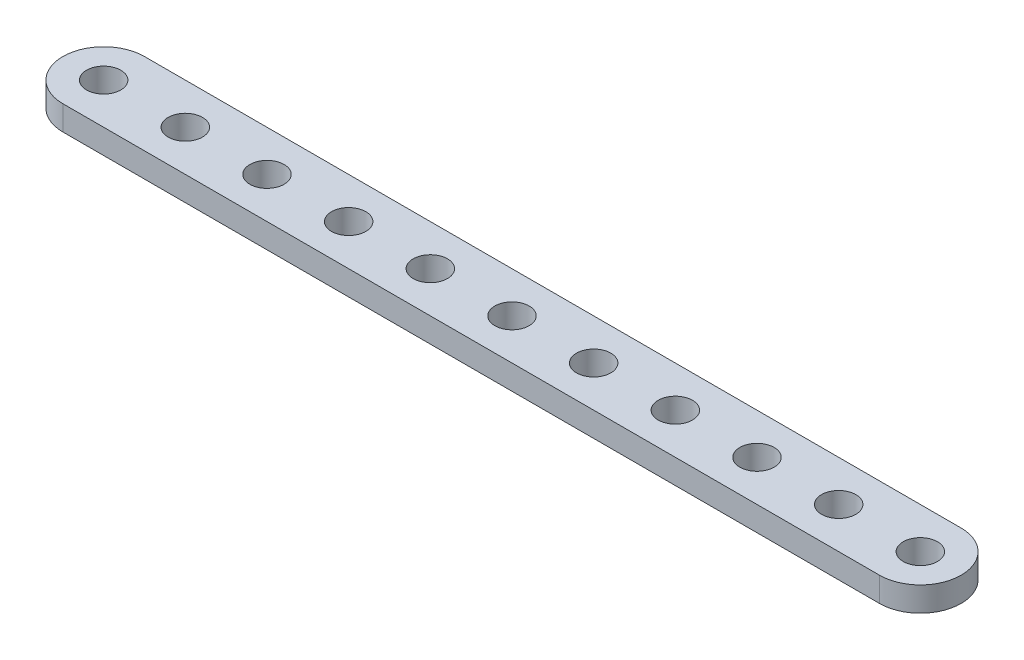
ISO-10303-21;
HEADER;
FILE_DESCRIPTION(('STEP AP214'),'2;1');
FILE_NAME('part.step','',(''),(''),'','','');
FILE_SCHEMA(('AUTOMOTIVE_DESIGN { 1 0 10303 214 1 1 1 1 }'));
ENDSEC;
DATA;
#1=APPLICATION_CONTEXT('core data for automotive mechanical design processes');
#2=APPLICATION_PROTOCOL_DEFINITION('international standard','automotive_design',2000,#1);
#3=PRODUCT_CONTEXT('',#1,'mechanical');
#4=PRODUCT('Part','Part','',(#3));
#5=PRODUCT_RELATED_PRODUCT_CATEGORY('part','',(#4));
#6=PRODUCT_DEFINITION_FORMATION('','',#4);
#7=PRODUCT_DEFINITION_CONTEXT('part definition',#1,'design');
#8=PRODUCT_DEFINITION('design','',#6,#7);
#9=PRODUCT_DEFINITION_SHAPE('','',#8);
#10=(LENGTH_UNIT() NAMED_UNIT(*) SI_UNIT(.MILLI.,.METRE.));
#11=(NAMED_UNIT(*) PLANE_ANGLE_UNIT() SI_UNIT($,.RADIAN.));
#12=(NAMED_UNIT(*) SI_UNIT($,.STERADIAN.) SOLID_ANGLE_UNIT());
#13=UNCERTAINTY_MEASURE_WITH_UNIT(LENGTH_MEASURE(1.E-05),#10,'distance_accuracy_value','');
#14=(GEOMETRIC_REPRESENTATION_CONTEXT(3) GLOBAL_UNCERTAINTY_ASSIGNED_CONTEXT((#13)) GLOBAL_UNIT_ASSIGNED_CONTEXT((#10,
#11,#12)) REPRESENTATION_CONTEXT('',''));
#15=CARTESIAN_POINT('',(0.,0.,0.));
#16=DIRECTION('',(0.,0.,1.));
#17=DIRECTION('',(1.,0.,0.));
#18=AXIS2_PLACEMENT_3D('',#15,#16,#17);
#19=CARTESIAN_POINT('',(-50.,1.5,0.));
#20=DIRECTION('',(0.,1.,0.));
#21=DIRECTION('',(0.,0.,1.));
#22=AXIS2_PLACEMENT_3D('',#19,#20,#21);
#23=PLANE('',#22);
#24=CARTESIAN_POINT('',(-40.,1.5,6.10096939004554E-13));
#25=DIRECTION('',(0.,1.,0.));
#26=DIRECTION('',(0.,0.,1.));
#27=AXIS2_PLACEMENT_3D('',#24,#25,#26);
#28=CIRCLE('',#27,2.1);
#29=CARTESIAN_POINT('',(-40.,1.5,2.10000000000061));
#30=VERTEX_POINT('',#29);
#31=EDGE_CURVE('E202',#30,#30,#28,.T.);
#32=ORIENTED_EDGE('',*,*,#31,.F.);
#33=EDGE_LOOP('',(#32));
#34=FACE_BOUND('',#33,.T.);
#35=CARTESIAN_POINT('',(-20.,1.5,4.70437685450828E-13));
#36=DIRECTION('',(0.,1.,0.));
#37=DIRECTION('',(0.,0.,1.));
#38=AXIS2_PLACEMENT_3D('',#35,#36,#37);
#39=CIRCLE('',#38,2.1);
#40=CARTESIAN_POINT('',(-20.,1.5,2.10000000000047));
#41=VERTEX_POINT('',#40);
#42=EDGE_CURVE('E186',#41,#41,#39,.T.);
#43=ORIENTED_EDGE('',*,*,#42,.F.);
#44=EDGE_LOOP('',(#43));
#45=FACE_BOUND('',#44,.T.);
#46=CARTESIAN_POINT('',(0.,1.5,3.30778431897103E-13));
#47=DIRECTION('',(0.,1.,0.));
#48=DIRECTION('',(0.,0.,1.));
#49=AXIS2_PLACEMENT_3D('',#46,#47,#48);
#50=CIRCLE('',#49,2.1);
#51=CARTESIAN_POINT('',(0.,1.5,2.10000000000033));
#52=VERTEX_POINT('',#51);
#53=EDGE_CURVE('E170',#52,#52,#50,.T.);
#54=ORIENTED_EDGE('',*,*,#53,.F.);
#55=EDGE_LOOP('',(#54));
#56=FACE_BOUND('',#55,.T.);
#57=CARTESIAN_POINT('',(20.,1.5,1.91119178343378E-13));
#58=DIRECTION('',(0.,1.,0.));
#59=DIRECTION('',(0.,0.,1.));
#60=AXIS2_PLACEMENT_3D('',#57,#58,#59);
#61=CIRCLE('',#60,2.1);
#62=CARTESIAN_POINT('',(20.,1.5,2.10000000000019));
#63=VERTEX_POINT('',#62);
#64=EDGE_CURVE('E154',#63,#63,#61,.T.);
#65=ORIENTED_EDGE('',*,*,#64,.F.);
#66=EDGE_LOOP('',(#65));
#67=FACE_BOUND('',#66,.T.);
#68=CARTESIAN_POINT('',(40.,1.5,0.));
#69=DIRECTION('',(0.,1.,0.));
#70=DIRECTION('',(0.,0.,1.));
#71=AXIS2_PLACEMENT_3D('',#68,#69,#70);
#72=CIRCLE('',#71,2.1);
#73=CARTESIAN_POINT('',(40.,1.5,2.10000000000005));
#74=VERTEX_POINT('',#73);
#75=EDGE_CURVE('E138',#74,#74,#72,.T.);
#76=ORIENTED_EDGE('',*,*,#75,.F.);
#77=EDGE_LOOP('',(#76));
#78=FACE_BOUND('',#77,.T.);
#79=CARTESIAN_POINT('',(-50.,1.5,0.));
#80=DIRECTION('',(0.,1.,0.));
#81=DIRECTION('',(0.,0.,1.));
#82=AXIS2_PLACEMENT_3D('',#79,#80,#81);
#83=CIRCLE('',#82,5.);
#84=CARTESIAN_POINT('',(-50.,1.5,-5.));
#85=VERTEX_POINT('',#84);
#86=CARTESIAN_POINT('',(-50.,1.5,5.));
#87=VERTEX_POINT('',#86);
#88=EDGE_CURVE('E96',#85,#87,#83,.T.);
#89=ORIENTED_EDGE('',*,*,#88,.T.);
#90=DIRECTION('',(1.,0.,0.));
#91=VECTOR('',#90,1.);
#92=CARTESIAN_POINT('',(-50.,1.5,5.));
#93=LINE('',#92,#91);
#94=CARTESIAN_POINT('',(50.,1.5,4.99999999999998));
#95=VERTEX_POINT('',#94);
#96=EDGE_CURVE('E91',#87,#95,#93,.T.);
#97=ORIENTED_EDGE('',*,*,#96,.T.);
#98=CARTESIAN_POINT('',(50.,1.5,0.));
#99=DIRECTION('',(0.,1.,0.));
#100=DIRECTION('',(0.,0.,1.));
#101=AXIS2_PLACEMENT_3D('',#98,#99,#100);
#102=CIRCLE('',#101,5.);
#103=CARTESIAN_POINT('',(50.,1.5,-5.00000000000002));
#104=VERTEX_POINT('',#103);
#105=EDGE_CURVE('E94',#95,#104,#102,.T.);
#106=ORIENTED_EDGE('',*,*,#105,.T.);
#107=DIRECTION('',(-1.,0.,0.));
#108=VECTOR('',#107,1.);
#109=CARTESIAN_POINT('',(-50.,1.5,-5.));
#110=LINE('',#109,#108);
#111=EDGE_CURVE('E61',#104,#85,#110,.T.);
#112=ORIENTED_EDGE('',*,*,#111,.T.);
#113=EDGE_LOOP('',(#89,#97,#106,#112));
#114=FACE_BOUND('',#113,.T.);
#115=CARTESIAN_POINT('',(50.,1.5,0.));
#116=DIRECTION('',(0.,1.,0.));
#117=DIRECTION('',(0.,0.,1.));
#118=AXIS2_PLACEMENT_3D('',#115,#116,#117);
#119=CIRCLE('',#118,2.1);
#120=CARTESIAN_POINT('',(50.,1.5,2.09999999999998));
#121=VERTEX_POINT('',#120);
#122=EDGE_CURVE('E116',#121,#121,#119,.T.);
#123=ORIENTED_EDGE('',*,*,#122,.F.);
#124=EDGE_LOOP('',(#123));
#125=FACE_BOUND('',#124,.T.);
#126=CARTESIAN_POINT('',(30.,1.5,1.21289551566515E-13));
#127=DIRECTION('',(0.,1.,0.));
#128=DIRECTION('',(0.,0.,1.));
#129=AXIS2_PLACEMENT_3D('',#126,#127,#128);
#130=CIRCLE('',#129,2.1);
#131=CARTESIAN_POINT('',(30.,1.5,2.10000000000012));
#132=VERTEX_POINT('',#131);
#133=EDGE_CURVE('E146',#132,#132,#130,.T.);
#134=ORIENTED_EDGE('',*,*,#133,.F.);
#135=EDGE_LOOP('',(#134));
#136=FACE_BOUND('',#135,.T.);
#137=CARTESIAN_POINT('',(10.,1.5,2.6094880512024E-13));
#138=DIRECTION('',(0.,1.,0.));
#139=DIRECTION('',(0.,0.,1.));
#140=AXIS2_PLACEMENT_3D('',#137,#138,#139);
#141=CIRCLE('',#140,2.1);
#142=CARTESIAN_POINT('',(10.,1.5,2.10000000000026));
#143=VERTEX_POINT('',#142);
#144=EDGE_CURVE('E162',#143,#143,#141,.T.);
#145=ORIENTED_EDGE('',*,*,#144,.F.);
#146=EDGE_LOOP('',(#145));
#147=FACE_BOUND('',#146,.T.);
#148=CARTESIAN_POINT('',(-9.99999999999999,1.5,4.00608058673966E-13));
#149=DIRECTION('',(0.,1.,0.));
#150=DIRECTION('',(0.,0.,1.));
#151=AXIS2_PLACEMENT_3D('',#148,#149,#150);
#152=CIRCLE('',#151,2.1);
#153=CARTESIAN_POINT('',(-9.99999999999999,1.5,2.1000000000004));
#154=VERTEX_POINT('',#153);
#155=EDGE_CURVE('E178',#154,#154,#152,.T.);
#156=ORIENTED_EDGE('',*,*,#155,.F.);
#157=EDGE_LOOP('',(#156));
#158=FACE_BOUND('',#157,.T.);
#159=CARTESIAN_POINT('',(-30.,1.5,5.40267312227691E-13));
#160=DIRECTION('',(0.,1.,0.));
#161=DIRECTION('',(0.,0.,1.));
#162=AXIS2_PLACEMENT_3D('',#159,#160,#161);
#163=CIRCLE('',#162,2.1);
#164=CARTESIAN_POINT('',(-30.,1.5,2.10000000000054));
#165=VERTEX_POINT('',#164);
#166=EDGE_CURVE('E194',#165,#165,#163,.T.);
#167=ORIENTED_EDGE('',*,*,#166,.F.);
#168=EDGE_LOOP('',(#167));
#169=FACE_BOUND('',#168,.T.);
#170=CARTESIAN_POINT('',(-50.,1.5,6.79926565781417E-13));
#171=DIRECTION('',(0.,1.,0.));
#172=DIRECTION('',(0.,0.,1.));
#173=AXIS2_PLACEMENT_3D('',#170,#171,#172);
#174=CIRCLE('',#173,2.1);
#175=CARTESIAN_POINT('',(-50.,1.5,2.10000000000068));
#176=VERTEX_POINT('',#175);
#177=EDGE_CURVE('E210',#176,#176,#174,.T.);
#178=ORIENTED_EDGE('',*,*,#177,.F.);
#179=EDGE_LOOP('',(#178));
#180=FACE_BOUND('',#179,.T.);
#181=ADVANCED_FACE('F43',(#34,#45,#56,#67,#78,#114,#125,#136,#147,#158,#169,#180),#23,.T.);
#182=CARTESIAN_POINT('',(-50.,-1.5,0.));
#183=DIRECTION('',(0.,1.,0.));
#184=DIRECTION('',(0.,0.,1.));
#185=AXIS2_PLACEMENT_3D('',#182,#183,#184);
#186=PLANE('',#185);
#187=CARTESIAN_POINT('',(-50.,-1.5,0.));
#188=DIRECTION('',(0.,1.,0.));
#189=DIRECTION('',(0.,0.,1.));
#190=AXIS2_PLACEMENT_3D('',#187,#188,#189);
#191=CIRCLE('',#190,5.);
#192=CARTESIAN_POINT('',(-50.,-1.5,-5.));
#193=VERTEX_POINT('',#192);
#194=CARTESIAN_POINT('',(-50.,-1.5,5.));
#195=VERTEX_POINT('',#194);
#196=EDGE_CURVE('E112',#193,#195,#191,.T.);
#197=ORIENTED_EDGE('',*,*,#196,.F.);
#198=DIRECTION('',(-1.,0.,0.));
#199=VECTOR('',#198,1.);
#200=CARTESIAN_POINT('',(-50.,-1.5,-5.));
#201=LINE('',#200,#199);
#202=CARTESIAN_POINT('',(50.,-1.5,-5.00000000000002));
#203=VERTEX_POINT('',#202);
#204=EDGE_CURVE('E84',#203,#193,#201,.T.);
#205=ORIENTED_EDGE('',*,*,#204,.F.);
#206=CARTESIAN_POINT('',(50.,-1.5,0.));
#207=DIRECTION('',(0.,1.,0.));
#208=DIRECTION('',(0.,0.,1.));
#209=AXIS2_PLACEMENT_3D('',#206,#207,#208);
#210=CIRCLE('',#209,5.);
#211=CARTESIAN_POINT('',(50.,-1.5,4.99999999999998));
#212=VERTEX_POINT('',#211);
#213=EDGE_CURVE('E78',#212,#203,#210,.T.);
#214=ORIENTED_EDGE('',*,*,#213,.F.);
#215=DIRECTION('',(1.,0.,0.));
#216=VECTOR('',#215,1.);
#217=CARTESIAN_POINT('',(-50.,-1.5,5.));
#218=LINE('',#217,#216);
#219=EDGE_CURVE('E101',#195,#212,#218,.T.);
#220=ORIENTED_EDGE('',*,*,#219,.F.);
#221=EDGE_LOOP('',(#197,#205,#214,#220));
#222=FACE_BOUND('',#221,.T.);
#223=CARTESIAN_POINT('',(50.,-1.5,0.));
#224=DIRECTION('',(0.,1.,0.));
#225=DIRECTION('',(0.,0.,1.));
#226=AXIS2_PLACEMENT_3D('',#223,#224,#225);
#227=CIRCLE('',#226,2.1);
#228=CARTESIAN_POINT('',(50.,-1.5,2.09999999999998));
#229=VERTEX_POINT('',#228);
#230=EDGE_CURVE('E134',#229,#229,#227,.T.);
#231=ORIENTED_EDGE('',*,*,#230,.T.);
#232=EDGE_LOOP('',(#231));
#233=FACE_BOUND('',#232,.T.);
#234=CARTESIAN_POINT('',(40.,-1.5,0.));
#235=DIRECTION('',(0.,1.,0.));
#236=DIRECTION('',(0.,0.,1.));
#237=AXIS2_PLACEMENT_3D('',#234,#235,#236);
#238=CIRCLE('',#237,2.1);
#239=CARTESIAN_POINT('',(40.,-1.5,2.10000000000005));
#240=VERTEX_POINT('',#239);
#241=EDGE_CURVE('E142',#240,#240,#238,.T.);
#242=ORIENTED_EDGE('',*,*,#241,.T.);
#243=EDGE_LOOP('',(#242));
#244=FACE_BOUND('',#243,.T.);
#245=CARTESIAN_POINT('',(30.,-1.5,1.21289551566515E-13));
#246=DIRECTION('',(0.,1.,0.));
#247=DIRECTION('',(0.,0.,1.));
#248=AXIS2_PLACEMENT_3D('',#245,#246,#247);
#249=CIRCLE('',#248,2.1);
#250=CARTESIAN_POINT('',(30.,-1.5,2.10000000000012));
#251=VERTEX_POINT('',#250);
#252=EDGE_CURVE('E150',#251,#251,#249,.T.);
#253=ORIENTED_EDGE('',*,*,#252,.T.);
#254=EDGE_LOOP('',(#253));
#255=FACE_BOUND('',#254,.T.);
#256=CARTESIAN_POINT('',(20.,-1.5,1.91119178343378E-13));
#257=DIRECTION('',(0.,1.,0.));
#258=DIRECTION('',(0.,0.,1.));
#259=AXIS2_PLACEMENT_3D('',#256,#257,#258);
#260=CIRCLE('',#259,2.1);
#261=CARTESIAN_POINT('',(20.,-1.5,2.10000000000019));
#262=VERTEX_POINT('',#261);
#263=EDGE_CURVE('E158',#262,#262,#260,.T.);
#264=ORIENTED_EDGE('',*,*,#263,.T.);
#265=EDGE_LOOP('',(#264));
#266=FACE_BOUND('',#265,.T.);
#267=CARTESIAN_POINT('',(10.,-1.5,2.6094880512024E-13));
#268=DIRECTION('',(0.,1.,0.));
#269=DIRECTION('',(0.,0.,1.));
#270=AXIS2_PLACEMENT_3D('',#267,#268,#269);
#271=CIRCLE('',#270,2.1);
#272=CARTESIAN_POINT('',(10.,-1.5,2.10000000000026));
#273=VERTEX_POINT('',#272);
#274=EDGE_CURVE('E166',#273,#273,#271,.T.);
#275=ORIENTED_EDGE('',*,*,#274,.T.);
#276=EDGE_LOOP('',(#275));
#277=FACE_BOUND('',#276,.T.);
#278=CARTESIAN_POINT('',(0.,-1.5,3.30778431897103E-13));
#279=DIRECTION('',(0.,1.,0.));
#280=DIRECTION('',(0.,0.,1.));
#281=AXIS2_PLACEMENT_3D('',#278,#279,#280);
#282=CIRCLE('',#281,2.1);
#283=CARTESIAN_POINT('',(0.,-1.5,2.10000000000033));
#284=VERTEX_POINT('',#283);
#285=EDGE_CURVE('E174',#284,#284,#282,.T.);
#286=ORIENTED_EDGE('',*,*,#285,.T.);
#287=EDGE_LOOP('',(#286));
#288=FACE_BOUND('',#287,.T.);
#289=CARTESIAN_POINT('',(-9.99999999999999,-1.5,4.00608058673966E-13));
#290=DIRECTION('',(0.,1.,0.));
#291=DIRECTION('',(0.,0.,1.));
#292=AXIS2_PLACEMENT_3D('',#289,#290,#291);
#293=CIRCLE('',#292,2.1);
#294=CARTESIAN_POINT('',(-9.99999999999999,-1.5,2.1000000000004));
#295=VERTEX_POINT('',#294);
#296=EDGE_CURVE('E182',#295,#295,#293,.T.);
#297=ORIENTED_EDGE('',*,*,#296,.T.);
#298=EDGE_LOOP('',(#297));
#299=FACE_BOUND('',#298,.T.);
#300=CARTESIAN_POINT('',(-20.,-1.5,4.70437685450828E-13));
#301=DIRECTION('',(0.,1.,0.));
#302=DIRECTION('',(0.,0.,1.));
#303=AXIS2_PLACEMENT_3D('',#300,#301,#302);
#304=CIRCLE('',#303,2.1);
#305=CARTESIAN_POINT('',(-20.,-1.5,2.10000000000047));
#306=VERTEX_POINT('',#305);
#307=EDGE_CURVE('E190',#306,#306,#304,.T.);
#308=ORIENTED_EDGE('',*,*,#307,.T.);
#309=EDGE_LOOP('',(#308));
#310=FACE_BOUND('',#309,.T.);
#311=CARTESIAN_POINT('',(-30.,-1.5,5.40267312227691E-13));
#312=DIRECTION('',(0.,1.,0.));
#313=DIRECTION('',(0.,0.,1.));
#314=AXIS2_PLACEMENT_3D('',#311,#312,#313);
#315=CIRCLE('',#314,2.1);
#316=CARTESIAN_POINT('',(-30.,-1.5,2.10000000000054));
#317=VERTEX_POINT('',#316);
#318=EDGE_CURVE('E198',#317,#317,#315,.T.);
#319=ORIENTED_EDGE('',*,*,#318,.T.);
#320=EDGE_LOOP('',(#319));
#321=FACE_BOUND('',#320,.T.);
#322=CARTESIAN_POINT('',(-40.,-1.5,6.10096939004554E-13));
#323=DIRECTION('',(0.,1.,0.));
#324=DIRECTION('',(0.,0.,1.));
#325=AXIS2_PLACEMENT_3D('',#322,#323,#324);
#326=CIRCLE('',#325,2.1);
#327=CARTESIAN_POINT('',(-40.,-1.5,2.10000000000061));
#328=VERTEX_POINT('',#327);
#329=EDGE_CURVE('E206',#328,#328,#326,.T.);
#330=ORIENTED_EDGE('',*,*,#329,.T.);
#331=EDGE_LOOP('',(#330));
#332=FACE_BOUND('',#331,.T.);
#333=CARTESIAN_POINT('',(-50.,-1.5,6.79926565781417E-13));
#334=DIRECTION('',(0.,1.,0.));
#335=DIRECTION('',(0.,0.,1.));
#336=AXIS2_PLACEMENT_3D('',#333,#334,#335);
#337=CIRCLE('',#336,2.1);
#338=CARTESIAN_POINT('',(-50.,-1.5,2.10000000000068));
#339=VERTEX_POINT('',#338);
#340=EDGE_CURVE('E214',#339,#339,#337,.T.);
#341=ORIENTED_EDGE('',*,*,#340,.T.);
#342=EDGE_LOOP('',(#341));
#343=FACE_BOUND('',#342,.T.);
#344=ADVANCED_FACE('F129',(#222,#233,#244,#255,#266,#277,#288,#299,#310,#321,#332,#343),#186,.F.);
#345=CARTESIAN_POINT('',(-50.,1.5,0.));
#346=DIRECTION('',(0.,-1.,0.));
#347=DIRECTION('',(0.,0.,-1.));
#348=AXIS2_PLACEMENT_3D('',#345,#346,#347);
#349=CYLINDRICAL_SURFACE('',#348,5.);
#350=ORIENTED_EDGE('',*,*,#196,.T.);
#351=DIRECTION('',(0.,-1.,0.));
#352=VECTOR('',#351,1.);
#353=CARTESIAN_POINT('',(-50.,1.5,5.));
#354=LINE('',#353,#352);
#355=EDGE_CURVE('E11',#87,#195,#354,.T.);
#356=ORIENTED_EDGE('',*,*,#355,.F.);
#357=ORIENTED_EDGE('',*,*,#88,.F.);
#358=DIRECTION('',(0.,-1.,0.));
#359=VECTOR('',#358,1.);
#360=CARTESIAN_POINT('',(-50.,1.5,-5.));
#361=LINE('',#360,#359);
#362=EDGE_CURVE('E108',#85,#193,#361,.T.);
#363=ORIENTED_EDGE('',*,*,#362,.T.);
#364=EDGE_LOOP('',(#350,#356,#357,#363));
#365=FACE_BOUND('',#364,.T.);
#366=ADVANCED_FACE('F45',(#365),#349,.T.);
#367=CARTESIAN_POINT('',(-50.,1.5,5.));
#368=DIRECTION('',(0.,0.,-1.));
#369=DIRECTION('',(-1.,0.,0.));
#370=AXIS2_PLACEMENT_3D('',#367,#368,#369);
#371=PLANE('',#370);
#372=ORIENTED_EDGE('',*,*,#219,.T.);
#373=DIRECTION('',(0.,-1.,0.));
#374=VECTOR('',#373,1.);
#375=CARTESIAN_POINT('',(50.,1.5,4.99999999999998));
#376=LINE('',#375,#374);
#377=EDGE_CURVE('E53',#95,#212,#376,.T.);
#378=ORIENTED_EDGE('',*,*,#377,.F.);
#379=ORIENTED_EDGE('',*,*,#96,.F.);
#380=ORIENTED_EDGE('',*,*,#355,.T.);
#381=EDGE_LOOP('',(#372,#378,#379,#380));
#382=FACE_BOUND('',#381,.T.);
#383=ADVANCED_FACE('F100',(#382),#371,.F.);
#384=CARTESIAN_POINT('',(50.,1.5,0.));
#385=DIRECTION('',(0.,-1.,0.));
#386=DIRECTION('',(0.,0.,-1.));
#387=AXIS2_PLACEMENT_3D('',#384,#385,#386);
#388=CYLINDRICAL_SURFACE('',#387,5.);
#389=ORIENTED_EDGE('',*,*,#213,.T.);
#390=DIRECTION('',(0.,-1.,0.));
#391=VECTOR('',#390,1.);
#392=CARTESIAN_POINT('',(50.,1.5,-5.00000000000002));
#393=LINE('',#392,#391);
#394=EDGE_CURVE('E103',#104,#203,#393,.T.);
#395=ORIENTED_EDGE('',*,*,#394,.F.);
#396=ORIENTED_EDGE('',*,*,#105,.F.);
#397=ORIENTED_EDGE('',*,*,#377,.T.);
#398=EDGE_LOOP('',(#389,#395,#396,#397));
#399=FACE_BOUND('',#398,.T.);
#400=ADVANCED_FACE('F104',(#399),#388,.T.);
#401=CARTESIAN_POINT('',(-50.,1.5,-5.));
#402=DIRECTION('',(0.,0.,1.));
#403=DIRECTION('',(1.,0.,0.));
#404=AXIS2_PLACEMENT_3D('',#401,#402,#403);
#405=PLANE('',#404);
#406=ORIENTED_EDGE('',*,*,#204,.T.);
#407=ORIENTED_EDGE('',*,*,#362,.F.);
#408=ORIENTED_EDGE('',*,*,#111,.F.);
#409=ORIENTED_EDGE('',*,*,#394,.T.);
#410=EDGE_LOOP('',(#406,#407,#408,#409));
#411=FACE_BOUND('',#410,.T.);
#412=ADVANCED_FACE('F126',(#411),#405,.F.);
#413=CARTESIAN_POINT('',(50.,1.5,0.));
#414=DIRECTION('',(0.,-1.,0.));
#415=DIRECTION('',(0.,0.,-1.));
#416=AXIS2_PLACEMENT_3D('',#413,#414,#415);
#417=CYLINDRICAL_SURFACE('',#416,2.1);
#418=ORIENTED_EDGE('',*,*,#122,.T.);
#419=EDGE_LOOP('',(#418));
#420=FACE_BOUND('',#419,.T.);
#421=ORIENTED_EDGE('',*,*,#230,.F.);
#422=EDGE_LOOP('',(#421));
#423=FACE_BOUND('',#422,.T.);
#424=ADVANCED_FACE('F235',(#420,#423),#417,.F.);
#425=CARTESIAN_POINT('',(40.,1.5,0.));
#426=DIRECTION('',(0.,-1.,0.));
#427=DIRECTION('',(0.,0.,-1.));
#428=AXIS2_PLACEMENT_3D('',#425,#426,#427);
#429=CYLINDRICAL_SURFACE('',#428,2.1);
#430=ORIENTED_EDGE('',*,*,#75,.T.);
#431=EDGE_LOOP('',(#430));
#432=FACE_BOUND('',#431,.T.);
#433=ORIENTED_EDGE('',*,*,#241,.F.);
#434=EDGE_LOOP('',(#433));
#435=FACE_BOUND('',#434,.T.);
#436=ADVANCED_FACE('F289',(#432,#435),#429,.F.);
#437=CARTESIAN_POINT('',(30.,1.5,1.21289551566515E-13));
#438=DIRECTION('',(0.,-1.,0.));
#439=DIRECTION('',(0.,0.,-1.));
#440=AXIS2_PLACEMENT_3D('',#437,#438,#439);
#441=CYLINDRICAL_SURFACE('',#440,2.1);
#442=ORIENTED_EDGE('',*,*,#133,.T.);
#443=EDGE_LOOP('',(#442));
#444=FACE_BOUND('',#443,.T.);
#445=ORIENTED_EDGE('',*,*,#252,.F.);
#446=EDGE_LOOP('',(#445));
#447=FACE_BOUND('',#446,.T.);
#448=ADVANCED_FACE('F298',(#444,#447),#441,.F.);
#449=CARTESIAN_POINT('',(20.,1.5,1.91119178343378E-13));
#450=DIRECTION('',(0.,-1.,0.));
#451=DIRECTION('',(0.,0.,-1.));
#452=AXIS2_PLACEMENT_3D('',#449,#450,#451);
#453=CYLINDRICAL_SURFACE('',#452,2.1);
#454=ORIENTED_EDGE('',*,*,#64,.T.);
#455=EDGE_LOOP('',(#454));
#456=FACE_BOUND('',#455,.T.);
#457=ORIENTED_EDGE('',*,*,#263,.F.);
#458=EDGE_LOOP('',(#457));
#459=FACE_BOUND('',#458,.T.);
#460=ADVANCED_FACE('F307',(#456,#459),#453,.F.);
#461=CARTESIAN_POINT('',(10.,1.5,2.6094880512024E-13));
#462=DIRECTION('',(0.,-1.,0.));
#463=DIRECTION('',(0.,0.,-1.));
#464=AXIS2_PLACEMENT_3D('',#461,#462,#463);
#465=CYLINDRICAL_SURFACE('',#464,2.1);
#466=ORIENTED_EDGE('',*,*,#144,.T.);
#467=EDGE_LOOP('',(#466));
#468=FACE_BOUND('',#467,.T.);
#469=ORIENTED_EDGE('',*,*,#274,.F.);
#470=EDGE_LOOP('',(#469));
#471=FACE_BOUND('',#470,.T.);
#472=ADVANCED_FACE('F317',(#468,#471),#465,.F.);
#473=CARTESIAN_POINT('',(0.,1.5,3.30778431897103E-13));
#474=DIRECTION('',(0.,-1.,0.));
#475=DIRECTION('',(0.,0.,-1.));
#476=AXIS2_PLACEMENT_3D('',#473,#474,#475);
#477=CYLINDRICAL_SURFACE('',#476,2.1);
#478=ORIENTED_EDGE('',*,*,#53,.T.);
#479=EDGE_LOOP('',(#478));
#480=FACE_BOUND('',#479,.T.);
#481=ORIENTED_EDGE('',*,*,#285,.F.);
#482=EDGE_LOOP('',(#481));
#483=FACE_BOUND('',#482,.T.);
#484=ADVANCED_FACE('F327',(#480,#483),#477,.F.);
#485=CARTESIAN_POINT('',(-9.99999999999999,1.5,4.00608058673966E-13));
#486=DIRECTION('',(0.,-1.,0.));
#487=DIRECTION('',(0.,0.,-1.));
#488=AXIS2_PLACEMENT_3D('',#485,#486,#487);
#489=CYLINDRICAL_SURFACE('',#488,2.1);
#490=ORIENTED_EDGE('',*,*,#155,.T.);
#491=EDGE_LOOP('',(#490));
#492=FACE_BOUND('',#491,.T.);
#493=ORIENTED_EDGE('',*,*,#296,.F.);
#494=EDGE_LOOP('',(#493));
#495=FACE_BOUND('',#494,.T.);
#496=ADVANCED_FACE('F337',(#492,#495),#489,.F.);
#497=CARTESIAN_POINT('',(-20.,1.5,4.70437685450828E-13));
#498=DIRECTION('',(0.,-1.,0.));
#499=DIRECTION('',(0.,0.,-1.));
#500=AXIS2_PLACEMENT_3D('',#497,#498,#499);
#501=CYLINDRICAL_SURFACE('',#500,2.1);
#502=ORIENTED_EDGE('',*,*,#42,.T.);
#503=EDGE_LOOP('',(#502));
#504=FACE_BOUND('',#503,.T.);
#505=ORIENTED_EDGE('',*,*,#307,.F.);
#506=EDGE_LOOP('',(#505));
#507=FACE_BOUND('',#506,.T.);
#508=ADVANCED_FACE('F347',(#504,#507),#501,.F.);
#509=CARTESIAN_POINT('',(-30.,1.5,5.40267312227691E-13));
#510=DIRECTION('',(0.,-1.,0.));
#511=DIRECTION('',(0.,0.,-1.));
#512=AXIS2_PLACEMENT_3D('',#509,#510,#511);
#513=CYLINDRICAL_SURFACE('',#512,2.1);
#514=ORIENTED_EDGE('',*,*,#166,.T.);
#515=EDGE_LOOP('',(#514));
#516=FACE_BOUND('',#515,.T.);
#517=ORIENTED_EDGE('',*,*,#318,.F.);
#518=EDGE_LOOP('',(#517));
#519=FACE_BOUND('',#518,.T.);
#520=ADVANCED_FACE('F357',(#516,#519),#513,.F.);
#521=CARTESIAN_POINT('',(-40.,1.5,6.10096939004554E-13));
#522=DIRECTION('',(0.,-1.,0.));
#523=DIRECTION('',(0.,0.,-1.));
#524=AXIS2_PLACEMENT_3D('',#521,#522,#523);
#525=CYLINDRICAL_SURFACE('',#524,2.1);
#526=ORIENTED_EDGE('',*,*,#31,.T.);
#527=EDGE_LOOP('',(#526));
#528=FACE_BOUND('',#527,.T.);
#529=ORIENTED_EDGE('',*,*,#329,.F.);
#530=EDGE_LOOP('',(#529));
#531=FACE_BOUND('',#530,.T.);
#532=ADVANCED_FACE('F367',(#528,#531),#525,.F.);
#533=CARTESIAN_POINT('',(-50.,1.5,6.79926565781417E-13));
#534=DIRECTION('',(0.,-1.,0.));
#535=DIRECTION('',(0.,0.,-1.));
#536=AXIS2_PLACEMENT_3D('',#533,#534,#535);
#537=CYLINDRICAL_SURFACE('',#536,2.1);
#538=ORIENTED_EDGE('',*,*,#177,.T.);
#539=EDGE_LOOP('',(#538));
#540=FACE_BOUND('',#539,.T.);
#541=ORIENTED_EDGE('',*,*,#340,.F.);
#542=EDGE_LOOP('',(#541));
#543=FACE_BOUND('',#542,.T.);
#544=ADVANCED_FACE('F222',(#540,#543),#537,.F.);
#545=CLOSED_SHELL('',(#181,#344,#366,#383,#400,#412,#424,#436,#448,#460,#472,#484,#496,#508,
#520,#532,#544));
#546=MANIFOLD_SOLID_BREP('B2',#545);
#547=ADVANCED_BREP_SHAPE_REPRESENTATION('',(#18,#546),#14);
#548=SHAPE_DEFINITION_REPRESENTATION(#9,#547);
ENDSEC;
END-ISO-10303-21;
